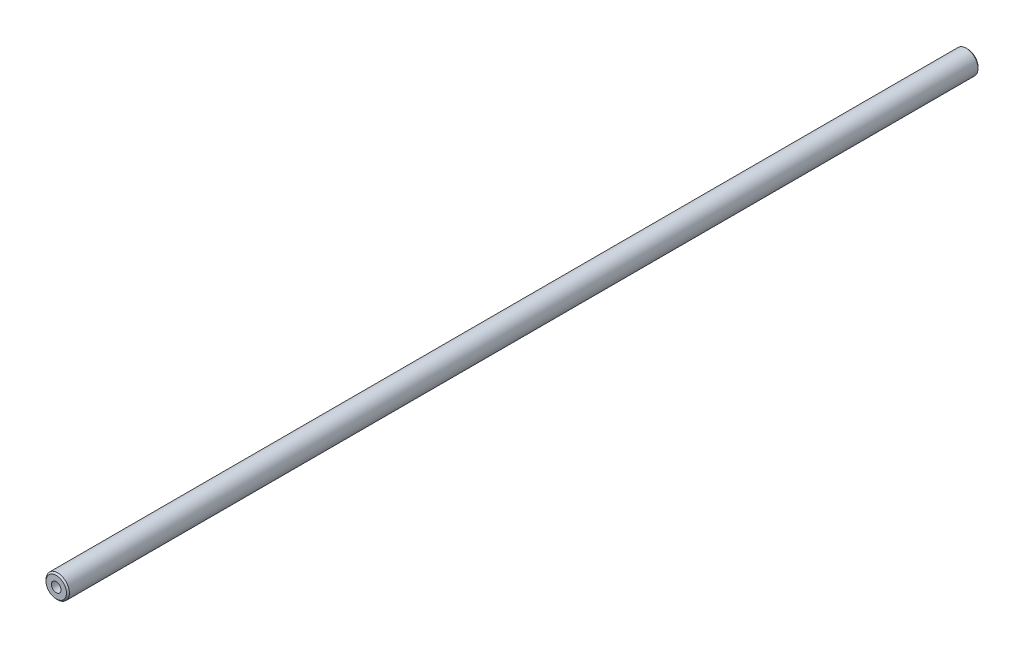
ISO-10303-21;
HEADER;
FILE_DESCRIPTION(('STEP AP214'),'2;1');
FILE_NAME('part.step','',(''),(''),'','','');
FILE_SCHEMA(('AUTOMOTIVE_DESIGN { 1 0 10303 214 1 1 1 1 }'));
ENDSEC;
DATA;
#1=APPLICATION_CONTEXT('core data for automotive mechanical design processes');
#2=APPLICATION_PROTOCOL_DEFINITION('international standard','automotive_design',2000,#1);
#3=PRODUCT_CONTEXT('',#1,'mechanical');
#4=PRODUCT('Part','Part','',(#3));
#5=PRODUCT_RELATED_PRODUCT_CATEGORY('part','',(#4));
#6=PRODUCT_DEFINITION_FORMATION('','',#4);
#7=PRODUCT_DEFINITION_CONTEXT('part definition',#1,'design');
#8=PRODUCT_DEFINITION('design','',#6,#7);
#9=PRODUCT_DEFINITION_SHAPE('','',#8);
#10=(LENGTH_UNIT() NAMED_UNIT(*) SI_UNIT(.MILLI.,.METRE.));
#11=(NAMED_UNIT(*) PLANE_ANGLE_UNIT() SI_UNIT($,.RADIAN.));
#12=(NAMED_UNIT(*) SI_UNIT($,.STERADIAN.) SOLID_ANGLE_UNIT());
#13=UNCERTAINTY_MEASURE_WITH_UNIT(LENGTH_MEASURE(1.E-05),#10,'distance_accuracy_value','');
#14=(GEOMETRIC_REPRESENTATION_CONTEXT(3) GLOBAL_UNCERTAINTY_ASSIGNED_CONTEXT((#13)) GLOBAL_UNIT_ASSIGNED_CONTEXT((#10,
#11,#12)) REPRESENTATION_CONTEXT('',''));
#15=CARTESIAN_POINT('',(0.,0.,0.));
#16=DIRECTION('',(0.,0.,1.));
#17=DIRECTION('',(1.,0.,0.));
#18=AXIS2_PLACEMENT_3D('',#15,#16,#17);
#19=CARTESIAN_POINT('',(0.,0.,300.499999999886));
#20=DIRECTION('',(0.,0.,1.));
#21=DIRECTION('',(1.,0.,0.));
#22=AXIS2_PLACEMENT_3D('',#19,#20,#21);
#23=CONICAL_SURFACE('',#22,1.64999999981319,1.02974425851388);
#24=CARTESIAN_POINT('',(-1.98951966012828E-10,0.,299.508579978465));
#25=VERTEX_POINT('',#24);
#26=VERTEX_LOOP('',#25);
#27=FACE_BOUND('',#26,.T.);
#28=CARTESIAN_POINT('',(0.,0.,300.5));
#29=DIRECTION('',(0.,0.,1.));
#30=DIRECTION('',(1.,0.,0.));
#31=AXIS2_PLACEMENT_3D('',#28,#29,#30);
#32=CIRCLE('',#31,1.64999999999999);
#33=CARTESIAN_POINT('',(1.64999999999999,0.,300.5));
#34=VERTEX_POINT('',#33);
#35=EDGE_CURVE('E37',#34,#34,#32,.T.);
#36=ORIENTED_EDGE('',*,*,#35,.T.);
#37=EDGE_LOOP('',(#36));
#38=FACE_BOUND('',#37,.T.);
#39=ADVANCED_FACE('F17',(#27,#38),#23,.F.);
#40=CARTESIAN_POINT('',(0.,0.,11.5000000000123));
#41=DIRECTION('',(0.,0.,-1.));
#42=DIRECTION('',(-1.,0.,0.));
#43=AXIS2_PLACEMENT_3D('',#40,#41,#42);
#44=CONICAL_SURFACE('',#43,1.65000000004056,1.02974425860513);
#45=CARTESIAN_POINT('',(0.,-5.68426539819307E-11,12.4914200214619));
#46=VERTEX_POINT('',#45);
#47=VERTEX_LOOP('',#46);
#48=FACE_BOUND('',#47,.T.);
#49=CARTESIAN_POINT('',(0.,0.,11.5));
#50=DIRECTION('',(0.,0.,-1.));
#51=DIRECTION('',(0.,1.,0.));
#52=AXIS2_PLACEMENT_3D('',#49,#50,#51);
#53=CIRCLE('',#52,1.64999999999999);
#54=CARTESIAN_POINT('',(0.,1.64999999999999,11.5));
#55=VERTEX_POINT('',#54);
#56=EDGE_CURVE('E39',#55,#55,#53,.T.);
#57=ORIENTED_EDGE('',*,*,#56,.T.);
#58=EDGE_LOOP('',(#57));
#59=FACE_BOUND('',#58,.T.);
#60=ADVANCED_FACE('F34',(#48,#59),#44,.F.);
#61=CARTESIAN_POINT('',(0.,0.,312.));
#62=DIRECTION('',(0.,0.,1.));
#63=DIRECTION('',(1.,0.,0.));
#64=AXIS2_PLACEMENT_3D('',#61,#62,#63);
#65=CYLINDRICAL_SURFACE('',#64,1.64999999999999);
#66=CARTESIAN_POINT('',(0.,0.,312.));
#67=DIRECTION('',(0.,0.,1.));
#68=DIRECTION('',(1.,0.,0.));
#69=AXIS2_PLACEMENT_3D('',#66,#67,#68);
#70=CIRCLE('',#69,1.64999999999999);
#71=CARTESIAN_POINT('',(1.64999999999999,0.,312.));
#72=VERTEX_POINT('',#71);
#73=EDGE_CURVE('E20',#72,#72,#70,.F.);
#74=ORIENTED_EDGE('',*,*,#73,.F.);
#75=EDGE_LOOP('',(#74));
#76=FACE_BOUND('',#75,.T.);
#77=ORIENTED_EDGE('',*,*,#35,.F.);
#78=EDGE_LOOP('',(#77));
#79=FACE_BOUND('',#78,.T.);
#80=ADVANCED_FACE('F59',(#76,#79),#65,.F.);
#81=CARTESIAN_POINT('',(0.,0.,0.));
#82=DIRECTION('',(0.,0.,-1.));
#83=DIRECTION('',(0.,1.,0.));
#84=AXIS2_PLACEMENT_3D('',#81,#82,#83);
#85=CYLINDRICAL_SURFACE('',#84,1.64999999999999);
#86=ORIENTED_EDGE('',*,*,#56,.F.);
#87=EDGE_LOOP('',(#86));
#88=FACE_BOUND('',#87,.T.);
#89=CARTESIAN_POINT('',(0.,0.,0.));
#90=DIRECTION('',(0.,0.,-1.));
#91=DIRECTION('',(0.,1.,0.));
#92=AXIS2_PLACEMENT_3D('',#89,#90,#91);
#93=CIRCLE('',#92,1.64999999999999);
#94=CARTESIAN_POINT('',(0.,1.64999999999999,0.));
#95=VERTEX_POINT('',#94);
#96=EDGE_CURVE('E50',#95,#95,#93,.T.);
#97=ORIENTED_EDGE('',*,*,#96,.T.);
#98=EDGE_LOOP('',(#97));
#99=FACE_BOUND('',#98,.T.);
#100=ADVANCED_FACE('F61',(#88,#99),#85,.F.);
#101=CARTESIAN_POINT('',(0.,0.,312.));
#102=DIRECTION('',(0.,0.,1.));
#103=DIRECTION('',(1.,0.,0.));
#104=AXIS2_PLACEMENT_3D('',#101,#102,#103);
#105=PLANE('',#104);
#106=CARTESIAN_POINT('',(0.,0.,312.000000000012));
#107=DIRECTION('',(0.,0.,-1.));
#108=DIRECTION('',(-1.,0.,0.));
#109=AXIS2_PLACEMENT_3D('',#106,#107,#108);
#110=CIRCLE('',#109,3.49999999991724);
#111=CARTESIAN_POINT('',(-3.49999999991724,0.,312.000000000012));
#112=VERTEX_POINT('',#111);
#113=EDGE_CURVE('E48',#112,#112,#110,.T.);
#114=ORIENTED_EDGE('',*,*,#113,.F.);
#115=EDGE_LOOP('',(#114));
#116=FACE_BOUND('',#115,.T.);
#117=ORIENTED_EDGE('',*,*,#73,.T.);
#118=EDGE_LOOP('',(#117));
#119=FACE_BOUND('',#118,.T.);
#120=ADVANCED_FACE('F57',(#116,#119),#105,.T.);
#121=CARTESIAN_POINT('',(0.,0.,0.));
#122=DIRECTION('',(0.,0.,1.));
#123=DIRECTION('',(1.,0.,0.));
#124=AXIS2_PLACEMENT_3D('',#121,#122,#123);
#125=PLANE('',#124);
#126=CARTESIAN_POINT('',(0.,0.,0.));
#127=DIRECTION('',(0.,0.,1.));
#128=DIRECTION('',(1.,0.,0.));
#129=AXIS2_PLACEMENT_3D('',#126,#127,#128);
#130=CIRCLE('',#129,3.49999999997408);
#131=CARTESIAN_POINT('',(3.49999999997408,0.,0.));
#132=VERTEX_POINT('',#131);
#133=EDGE_CURVE('E45',#132,#132,#130,.T.);
#134=ORIENTED_EDGE('',*,*,#133,.F.);
#135=EDGE_LOOP('',(#134));
#136=FACE_BOUND('',#135,.T.);
#137=ORIENTED_EDGE('',*,*,#96,.F.);
#138=EDGE_LOOP('',(#137));
#139=FACE_BOUND('',#138,.T.);
#140=ADVANCED_FACE('F85',(#136,#139),#125,.F.);
#141=CARTESIAN_POINT('',(0.,0.,311.50000000008));
#142=DIRECTION('',(0.,0.,-1.));
#143=DIRECTION('',(-1.,0.,0.));
#144=AXIS2_PLACEMENT_3D('',#141,#142,#143);
#145=CONICAL_SURFACE('',#144,3.99999999984857,0.785398163397448);
#146=CARTESIAN_POINT('',(0.,0.,311.5));
#147=DIRECTION('',(0.,0.,-1.));
#148=DIRECTION('',(-1.,0.,0.));
#149=AXIS2_PLACEMENT_3D('',#146,#147,#148);
#150=CIRCLE('',#149,4.);
#151=CARTESIAN_POINT('',(-4.,0.,311.5));
#152=VERTEX_POINT('',#151);
#153=EDGE_CURVE('E26',#152,#152,#150,.T.);
#154=ORIENTED_EDGE('',*,*,#153,.F.);
#155=EDGE_LOOP('',(#154));
#156=FACE_BOUND('',#155,.T.);
#157=ORIENTED_EDGE('',*,*,#113,.T.);
#158=EDGE_LOOP('',(#157));
#159=FACE_BOUND('',#158,.T.);
#160=ADVANCED_FACE('F78',(#156,#159),#145,.T.);
#161=CARTESIAN_POINT('',(0.,0.,0.499999999931333));
#162=DIRECTION('',(0.,0.,1.));
#163=DIRECTION('',(1.,0.,0.));
#164=AXIS2_PLACEMENT_3D('',#161,#162,#163);
#165=CONICAL_SURFACE('',#164,3.99999999990541,0.785398163397448);
#166=CARTESIAN_POINT('',(0.,0.,0.499999999999945));
#167=DIRECTION('',(0.,0.,-1.));
#168=DIRECTION('',(-1.,0.,0.));
#169=AXIS2_PLACEMENT_3D('',#166,#167,#168);
#170=CIRCLE('',#169,4.);
#171=CARTESIAN_POINT('',(-4.,0.,0.499999999999945));
#172=VERTEX_POINT('',#171);
#173=EDGE_CURVE('E10',#172,#172,#170,.F.);
#174=ORIENTED_EDGE('',*,*,#173,.F.);
#175=EDGE_LOOP('',(#174));
#176=FACE_BOUND('',#175,.T.);
#177=ORIENTED_EDGE('',*,*,#133,.T.);
#178=EDGE_LOOP('',(#177));
#179=FACE_BOUND('',#178,.T.);
#180=ADVANCED_FACE('F72',(#176,#179),#165,.T.);
#181=CARTESIAN_POINT('',(0.,0.,312.));
#182=DIRECTION('',(0.,0.,-1.));
#183=DIRECTION('',(-1.,0.,0.));
#184=AXIS2_PLACEMENT_3D('',#181,#182,#183);
#185=CYLINDRICAL_SURFACE('',#184,4.);
#186=ORIENTED_EDGE('',*,*,#173,.T.);
#187=EDGE_LOOP('',(#186));
#188=FACE_BOUND('',#187,.T.);
#189=ORIENTED_EDGE('',*,*,#153,.T.);
#190=EDGE_LOOP('',(#189));
#191=FACE_BOUND('',#190,.T.);
#192=ADVANCED_FACE('F70',(#188,#191),#185,.T.);
#193=CLOSED_SHELL('',(#39,#60,#80,#100,#120,#140,#160,#180,#192));
#194=MANIFOLD_SOLID_BREP('B1',#193);
#195=ADVANCED_BREP_SHAPE_REPRESENTATION('',(#18,#194),#14);
#196=SHAPE_DEFINITION_REPRESENTATION(#9,#195);
ENDSEC;
END-ISO-10303-21;
